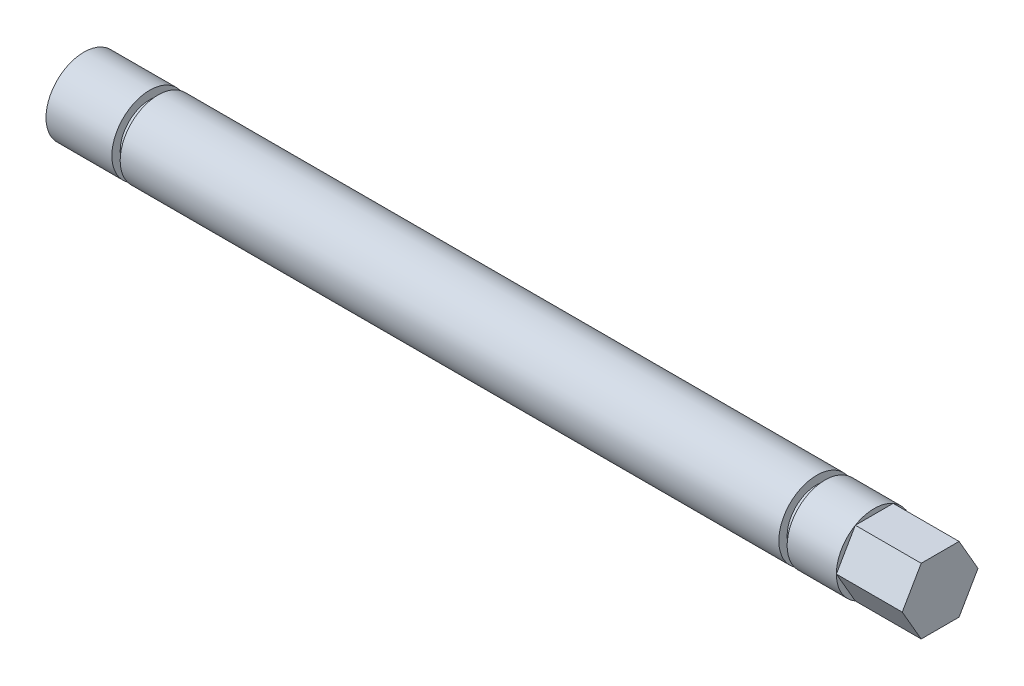
ISO-10303-21;
HEADER;
FILE_DESCRIPTION(('STEP AP214'),'2;1');
FILE_NAME('part.step','',(''),(''),'','','');
FILE_SCHEMA(('AUTOMOTIVE_DESIGN { 1 0 10303 214 1 1 1 1 }'));
ENDSEC;
DATA;
#1=APPLICATION_CONTEXT('core data for automotive mechanical design processes');
#2=APPLICATION_PROTOCOL_DEFINITION('international standard','automotive_design',2000,#1);
#3=PRODUCT_CONTEXT('',#1,'mechanical');
#4=PRODUCT('Part','Part','',(#3));
#5=PRODUCT_RELATED_PRODUCT_CATEGORY('part','',(#4));
#6=PRODUCT_DEFINITION_FORMATION('','',#4);
#7=PRODUCT_DEFINITION_CONTEXT('part definition',#1,'design');
#8=PRODUCT_DEFINITION('design','',#6,#7);
#9=PRODUCT_DEFINITION_SHAPE('','',#8);
#10=(LENGTH_UNIT() NAMED_UNIT(*) SI_UNIT(.MILLI.,.METRE.));
#11=(NAMED_UNIT(*) PLANE_ANGLE_UNIT() SI_UNIT($,.RADIAN.));
#12=(NAMED_UNIT(*) SI_UNIT($,.STERADIAN.) SOLID_ANGLE_UNIT());
#13=UNCERTAINTY_MEASURE_WITH_UNIT(LENGTH_MEASURE(1.E-05),#10,'distance_accuracy_value','');
#14=(GEOMETRIC_REPRESENTATION_CONTEXT(3) GLOBAL_UNCERTAINTY_ASSIGNED_CONTEXT((#13)) GLOBAL_UNIT_ASSIGNED_CONTEXT((#10,
#11,#12)) REPRESENTATION_CONTEXT('',''));
#15=CARTESIAN_POINT('',(0.,0.,0.));
#16=DIRECTION('',(0.,0.,1.));
#17=DIRECTION('',(1.,0.,0.));
#18=AXIS2_PLACEMENT_3D('',#15,#16,#17);
#19=CARTESIAN_POINT('',(165.1,0.,0.));
#20=DIRECTION('',(-1.,0.,0.));
#21=DIRECTION('',(0.,0.,1.));
#22=AXIS2_PLACEMENT_3D('',#19,#20,#21);
#23=CYLINDRICAL_SURFACE('',#22,7.3025);
#24=CARTESIAN_POINT('',(142.9004,0.,0.));
#25=DIRECTION('',(-1.,0.,0.));
#26=DIRECTION('',(0.,0.,1.));
#27=AXIS2_PLACEMENT_3D('',#24,#25,#26);
#28=CIRCLE('',#27,7.3025);
#29=CARTESIAN_POINT('',(142.9004,0.,7.3025));
#30=VERTEX_POINT('',#29);
#31=EDGE_CURVE('E148',#30,#30,#28,.T.);
#32=ORIENTED_EDGE('',*,*,#31,.F.);
#33=EDGE_LOOP('',(#32));
#34=FACE_BOUND('',#33,.T.);
#35=CARTESIAN_POINT('',(152.4,0.,0.));
#36=DIRECTION('',(1.,0.,0.));
#37=DIRECTION('',(0.,0.,-1.));
#38=AXIS2_PLACEMENT_3D('',#35,#36,#37);
#39=CIRCLE('',#38,7.3025);
#40=CARTESIAN_POINT('',(152.4,6.32415051113586,-3.65125));
#41=VERTEX_POINT('',#40);
#42=CARTESIAN_POINT('',(152.4,6.32415051113586,3.65125));
#43=VERTEX_POINT('',#42);
#44=EDGE_CURVE('E12',#41,#43,#39,.T.);
#45=ORIENTED_EDGE('',*,*,#44,.F.);
#46=CARTESIAN_POINT('',(152.4,0.,-7.3025));
#47=VERTEX_POINT('',#46);
#48=EDGE_CURVE('E44',#47,#41,#39,.T.);
#49=ORIENTED_EDGE('',*,*,#48,.F.);
#50=CARTESIAN_POINT('',(152.4,-6.32415051113586,-3.65125));
#51=VERTEX_POINT('',#50);
#52=EDGE_CURVE('E98',#51,#47,#39,.T.);
#53=ORIENTED_EDGE('',*,*,#52,.F.);
#54=CARTESIAN_POINT('',(152.4,-6.32415051113586,3.65125));
#55=VERTEX_POINT('',#54);
#56=EDGE_CURVE('E131',#55,#51,#39,.T.);
#57=ORIENTED_EDGE('',*,*,#56,.F.);
#58=CARTESIAN_POINT('',(152.4,0.,7.3025));
#59=VERTEX_POINT('',#58);
#60=EDGE_CURVE('E127',#59,#55,#39,.T.);
#61=ORIENTED_EDGE('',*,*,#60,.F.);
#62=EDGE_CURVE('E39',#43,#59,#39,.T.);
#63=ORIENTED_EDGE('',*,*,#62,.F.);
#64=EDGE_LOOP('',(#45,#49,#53,#57,#61,#63));
#65=FACE_BOUND('',#64,.T.);
#66=ADVANCED_FACE('F35',(#34,#65),#23,.T.);
#67=CARTESIAN_POINT('',(0.,0.,0.));
#68=DIRECTION('',(1.,0.,0.));
#69=DIRECTION('',(0.,0.,-1.));
#70=AXIS2_PLACEMENT_3D('',#67,#68,#69);
#71=CIRCLE('',#70,7.3025);
#72=CARTESIAN_POINT('',(0.,0.,-7.3025));
#73=VERTEX_POINT('',#72);
#74=EDGE_CURVE('E130',#73,#73,#71,.T.);
#75=ORIENTED_EDGE('',*,*,#74,.T.);
#76=EDGE_LOOP('',(#75));
#77=FACE_BOUND('',#76,.T.);
#78=CARTESIAN_POINT('',(12.7,0.,0.));
#79=DIRECTION('',(-1.,0.,0.));
#80=DIRECTION('',(0.,0.,1.));
#81=AXIS2_PLACEMENT_3D('',#78,#79,#80);
#82=CIRCLE('',#81,7.3025);
#83=CARTESIAN_POINT('',(12.7,0.,7.3025));
#84=VERTEX_POINT('',#83);
#85=EDGE_CURVE('E145',#84,#84,#82,.T.);
#86=ORIENTED_EDGE('',*,*,#85,.T.);
#87=EDGE_LOOP('',(#86));
#88=FACE_BOUND('',#87,.T.);
#89=ADVANCED_FACE('F37',(#77,#88),#23,.T.);
#90=CARTESIAN_POINT('',(0.,0.,0.));
#91=DIRECTION('',(1.,0.,0.));
#92=DIRECTION('',(0.,0.,-1.));
#93=AXIS2_PLACEMENT_3D('',#90,#91,#92);
#94=PLANE('',#93);
#95=ORIENTED_EDGE('',*,*,#74,.F.);
#96=EDGE_LOOP('',(#95));
#97=FACE_BOUND('',#96,.T.);
#98=ADVANCED_FACE('F206',(#97),#94,.F.);
#99=CARTESIAN_POINT('',(12.7,7.3025,0.));
#100=DIRECTION('',(1.,0.,0.));
#101=DIRECTION('',(0.,0.,-1.));
#102=AXIS2_PLACEMENT_3D('',#99,#100,#101);
#103=PLANE('',#102);
#104=CARTESIAN_POINT('',(12.7,0.,0.));
#105=DIRECTION('',(-1.,0.,0.));
#106=DIRECTION('',(0.,0.,1.));
#107=AXIS2_PLACEMENT_3D('',#104,#105,#106);
#108=CIRCLE('',#107,5.7023);
#109=CARTESIAN_POINT('',(12.7,0.,5.7023));
#110=VERTEX_POINT('',#109);
#111=EDGE_CURVE('E133',#110,#110,#108,.T.);
#112=ORIENTED_EDGE('',*,*,#111,.T.);
#113=EDGE_LOOP('',(#112));
#114=FACE_BOUND('',#113,.T.);
#115=ORIENTED_EDGE('',*,*,#85,.F.);
#116=EDGE_LOOP('',(#115));
#117=FACE_BOUND('',#116,.T.);
#118=ADVANCED_FACE('F230',(#114,#117),#103,.T.);
#119=CARTESIAN_POINT('',(0.,0.,0.));
#120=DIRECTION('',(-1.,0.,0.));
#121=DIRECTION('',(0.,0.,1.));
#122=AXIS2_PLACEMENT_3D('',#119,#120,#121);
#123=CYLINDRICAL_SURFACE('',#122,5.7023);
#124=CARTESIAN_POINT('',(14.3002,0.,0.));
#125=DIRECTION('',(-1.,0.,0.));
#126=DIRECTION('',(0.,0.,1.));
#127=AXIS2_PLACEMENT_3D('',#124,#125,#126);
#128=CIRCLE('',#127,5.7023);
#129=CARTESIAN_POINT('',(14.3002,0.,5.7023));
#130=VERTEX_POINT('',#129);
#131=EDGE_CURVE('E137',#130,#130,#128,.T.);
#132=ORIENTED_EDGE('',*,*,#131,.T.);
#133=EDGE_LOOP('',(#132));
#134=FACE_BOUND('',#133,.T.);
#135=ORIENTED_EDGE('',*,*,#111,.F.);
#136=EDGE_LOOP('',(#135));
#137=FACE_BOUND('',#136,.T.);
#138=ADVANCED_FACE('F219',(#134,#137),#123,.T.);
#139=CARTESIAN_POINT('',(14.3002,7.3025,0.));
#140=DIRECTION('',(-1.,0.,0.));
#141=DIRECTION('',(0.,0.,1.));
#142=AXIS2_PLACEMENT_3D('',#139,#140,#141);
#143=PLANE('',#142);
#144=CARTESIAN_POINT('',(14.3002,0.,0.));
#145=DIRECTION('',(-1.,0.,0.));
#146=DIRECTION('',(0.,0.,1.));
#147=AXIS2_PLACEMENT_3D('',#144,#145,#146);
#148=CIRCLE('',#147,7.3025);
#149=CARTESIAN_POINT('',(14.3002,0.,7.3025));
#150=VERTEX_POINT('',#149);
#151=EDGE_CURVE('E142',#150,#150,#148,.T.);
#152=ORIENTED_EDGE('',*,*,#151,.T.);
#153=EDGE_LOOP('',(#152));
#154=FACE_BOUND('',#153,.T.);
#155=ORIENTED_EDGE('',*,*,#131,.F.);
#156=EDGE_LOOP('',(#155));
#157=FACE_BOUND('',#156,.T.);
#158=ADVANCED_FACE('F210',(#154,#157),#143,.T.);
#159=CARTESIAN_POINT('',(141.3002,0.,0.));
#160=DIRECTION('',(-1.,0.,0.));
#161=DIRECTION('',(0.,0.,1.));
#162=AXIS2_PLACEMENT_3D('',#159,#160,#161);
#163=CIRCLE('',#162,7.3025);
#164=CARTESIAN_POINT('',(141.3002,0.,7.3025));
#165=VERTEX_POINT('',#164);
#166=EDGE_CURVE('E149',#165,#165,#163,.T.);
#167=ORIENTED_EDGE('',*,*,#166,.T.);
#168=EDGE_LOOP('',(#167));
#169=FACE_BOUND('',#168,.T.);
#170=ORIENTED_EDGE('',*,*,#151,.F.);
#171=EDGE_LOOP('',(#170));
#172=FACE_BOUND('',#171,.T.);
#173=ADVANCED_FACE('F202',(#169,#172),#23,.T.);
#174=CARTESIAN_POINT('',(142.9004,0.,0.));
#175=DIRECTION('',(-1.,0.,0.));
#176=DIRECTION('',(0.,0.,1.));
#177=AXIS2_PLACEMENT_3D('',#174,#175,#176);
#178=PLANE('',#177);
#179=CARTESIAN_POINT('',(142.9004,0.,0.));
#180=DIRECTION('',(-1.,0.,0.));
#181=DIRECTION('',(0.,0.,1.));
#182=AXIS2_PLACEMENT_3D('',#179,#180,#181);
#183=CIRCLE('',#182,5.7023);
#184=CARTESIAN_POINT('',(142.9004,0.,5.7023));
#185=VERTEX_POINT('',#184);
#186=EDGE_CURVE('E152',#185,#185,#183,.T.);
#187=ORIENTED_EDGE('',*,*,#186,.F.);
#188=EDGE_LOOP('',(#187));
#189=FACE_BOUND('',#188,.T.);
#190=ORIENTED_EDGE('',*,*,#31,.T.);
#191=EDGE_LOOP('',(#190));
#192=FACE_BOUND('',#191,.T.);
#193=ADVANCED_FACE('F209',(#189,#192),#178,.T.);
#194=CARTESIAN_POINT('',(141.3002,0.,0.));
#195=DIRECTION('',(-1.,0.,0.));
#196=DIRECTION('',(0.,0.,1.));
#197=AXIS2_PLACEMENT_3D('',#194,#195,#196);
#198=PLANE('',#197);
#199=CARTESIAN_POINT('',(141.3002,0.,0.));
#200=DIRECTION('',(-1.,0.,0.));
#201=DIRECTION('',(0.,0.,1.));
#202=AXIS2_PLACEMENT_3D('',#199,#200,#201);
#203=CIRCLE('',#202,5.7023);
#204=CARTESIAN_POINT('',(141.3002,0.,5.7023));
#205=VERTEX_POINT('',#204);
#206=EDGE_CURVE('E155',#205,#205,#203,.T.);
#207=ORIENTED_EDGE('',*,*,#206,.T.);
#208=EDGE_LOOP('',(#207));
#209=FACE_BOUND('',#208,.T.);
#210=ORIENTED_EDGE('',*,*,#166,.F.);
#211=EDGE_LOOP('',(#210));
#212=FACE_BOUND('',#211,.T.);
#213=ADVANCED_FACE('F216',(#209,#212),#198,.F.);
#214=CARTESIAN_POINT('',(142.9004,0.,0.));
#215=DIRECTION('',(-1.,0.,0.));
#216=DIRECTION('',(0.,0.,1.));
#217=AXIS2_PLACEMENT_3D('',#214,#215,#216);
#218=CYLINDRICAL_SURFACE('',#217,5.7023);
#219=ORIENTED_EDGE('',*,*,#186,.T.);
#220=EDGE_LOOP('',(#219));
#221=FACE_BOUND('',#220,.T.);
#222=ORIENTED_EDGE('',*,*,#206,.F.);
#223=EDGE_LOOP('',(#222));
#224=FACE_BOUND('',#223,.T.);
#225=ADVANCED_FACE('F282',(#221,#224),#218,.T.);
#226=CARTESIAN_POINT('',(152.4,0.,0.));
#227=DIRECTION('',(1.,0.,0.));
#228=DIRECTION('',(0.,0.,-1.));
#229=AXIS2_PLACEMENT_3D('',#226,#227,#228);
#230=PLANE('',#229);
#231=ORIENTED_EDGE('',*,*,#48,.T.);
#232=DIRECTION('',(0.,0.866025403784438,0.5));
#233=VECTOR('',#232,1.);
#234=CARTESIAN_POINT('',(152.4,0.,-7.3025));
#235=LINE('',#234,#233);
#236=EDGE_CURVE('E93',#47,#41,#235,.T.);
#237=ORIENTED_EDGE('',*,*,#236,.F.);
#238=EDGE_LOOP('',(#231,#237));
#239=FACE_BOUND('',#238,.T.);
#240=ADVANCED_FACE('F91',(#239),#230,.T.);
#241=ORIENTED_EDGE('',*,*,#44,.T.);
#242=DIRECTION('',(0.,0.,1.));
#243=VECTOR('',#242,1.);
#244=CARTESIAN_POINT('',(152.4,6.32415051113586,-3.65125));
#245=LINE('',#244,#243);
#246=EDGE_CURVE('E105',#41,#43,#245,.T.);
#247=ORIENTED_EDGE('',*,*,#246,.F.);
#248=EDGE_LOOP('',(#241,#247));
#249=FACE_BOUND('',#248,.T.);
#250=ADVANCED_FACE('F116',(#249),#230,.T.);
#251=ORIENTED_EDGE('',*,*,#62,.T.);
#252=DIRECTION('',(0.,-0.866025403784439,0.5));
#253=VECTOR('',#252,1.);
#254=CARTESIAN_POINT('',(152.4,6.32415051113586,3.65125));
#255=LINE('',#254,#253);
#256=EDGE_CURVE('E118',#43,#59,#255,.T.);
#257=ORIENTED_EDGE('',*,*,#256,.F.);
#258=EDGE_LOOP('',(#251,#257));
#259=FACE_BOUND('',#258,.T.);
#260=ADVANCED_FACE('F188',(#259),#230,.T.);
#261=ORIENTED_EDGE('',*,*,#60,.T.);
#262=DIRECTION('',(0.,-0.866025403784439,-0.5));
#263=VECTOR('',#262,1.);
#264=CARTESIAN_POINT('',(152.4,0.,7.3025));
#265=LINE('',#264,#263);
#266=EDGE_CURVE('E182',#59,#55,#265,.T.);
#267=ORIENTED_EDGE('',*,*,#266,.F.);
#268=EDGE_LOOP('',(#261,#267));
#269=FACE_BOUND('',#268,.T.);
#270=ADVANCED_FACE('F190',(#269),#230,.T.);
#271=ORIENTED_EDGE('',*,*,#56,.T.);
#272=DIRECTION('',(0.,0.,-1.));
#273=VECTOR('',#272,1.);
#274=CARTESIAN_POINT('',(152.4,-6.32415051113586,3.65125));
#275=LINE('',#274,#273);
#276=EDGE_CURVE('E51',#55,#51,#275,.T.);
#277=ORIENTED_EDGE('',*,*,#276,.F.);
#278=EDGE_LOOP('',(#271,#277));
#279=FACE_BOUND('',#278,.T.);
#280=ADVANCED_FACE('F196',(#279),#230,.T.);
#281=ORIENTED_EDGE('',*,*,#52,.T.);
#282=DIRECTION('',(0.,0.866025403784439,-0.5));
#283=VECTOR('',#282,1.);
#284=CARTESIAN_POINT('',(152.4,-6.32415051113586,-3.65125));
#285=LINE('',#284,#283);
#286=EDGE_CURVE('E113',#51,#47,#285,.T.);
#287=ORIENTED_EDGE('',*,*,#286,.F.);
#288=EDGE_LOOP('',(#281,#287));
#289=FACE_BOUND('',#288,.T.);
#290=ADVANCED_FACE('F258',(#289),#230,.T.);
#291=CARTESIAN_POINT('',(152.4,0.,-7.3025));
#292=DIRECTION('',(0.,0.5,-0.866025403784438));
#293=DIRECTION('',(0.,0.866025403784439,0.5));
#294=AXIS2_PLACEMENT_3D('',#291,#292,#293);
#295=PLANE('',#294);
#296=DIRECTION('',(0.,0.866025403784438,0.5));
#297=VECTOR('',#296,1.);
#298=CARTESIAN_POINT('',(165.1,0.,-7.3025));
#299=LINE('',#298,#297);
#300=CARTESIAN_POINT('',(165.1,0.,-7.3025));
#301=VERTEX_POINT('',#300);
#302=CARTESIAN_POINT('',(165.1,6.32415051113586,-3.65125));
#303=VERTEX_POINT('',#302);
#304=EDGE_CURVE('E178',#301,#303,#299,.T.);
#305=ORIENTED_EDGE('',*,*,#304,.F.);
#306=DIRECTION('',(1.,0.,0.));
#307=VECTOR('',#306,1.);
#308=CARTESIAN_POINT('',(152.4,0.,-7.3025));
#309=LINE('',#308,#307);
#310=EDGE_CURVE('E122',#47,#301,#309,.T.);
#311=ORIENTED_EDGE('',*,*,#310,.F.);
#312=ORIENTED_EDGE('',*,*,#236,.T.);
#313=DIRECTION('',(1.,0.,0.));
#314=VECTOR('',#313,1.);
#315=CARTESIAN_POINT('',(152.4,6.32415051113586,-3.65125));
#316=LINE('',#315,#314);
#317=EDGE_CURVE('E102',#41,#303,#316,.T.);
#318=ORIENTED_EDGE('',*,*,#317,.T.);
#319=EDGE_LOOP('',(#305,#311,#312,#318));
#320=FACE_BOUND('',#319,.T.);
#321=ADVANCED_FACE('F121',(#320),#295,.T.);
#322=CARTESIAN_POINT('',(152.4,-6.32415051113586,-3.65125));
#323=DIRECTION('',(0.,-0.5,-0.866025403784438));
#324=DIRECTION('',(0.,0.866025403784439,-0.5));
#325=AXIS2_PLACEMENT_3D('',#322,#323,#324);
#326=PLANE('',#325);
#327=DIRECTION('',(0.,0.866025403784439,-0.5));
#328=VECTOR('',#327,1.);
#329=CARTESIAN_POINT('',(165.1,-6.32415051113586,-3.65125));
#330=LINE('',#329,#328);
#331=CARTESIAN_POINT('',(165.1,-6.32415051113586,-3.65125));
#332=VERTEX_POINT('',#331);
#333=EDGE_CURVE('E123',#332,#301,#330,.T.);
#334=ORIENTED_EDGE('',*,*,#333,.F.);
#335=DIRECTION('',(1.,0.,0.));
#336=VECTOR('',#335,1.);
#337=CARTESIAN_POINT('',(152.4,-6.32415051113586,-3.65125));
#338=LINE('',#337,#336);
#339=EDGE_CURVE('E165',#51,#332,#338,.T.);
#340=ORIENTED_EDGE('',*,*,#339,.F.);
#341=ORIENTED_EDGE('',*,*,#286,.T.);
#342=ORIENTED_EDGE('',*,*,#310,.T.);
#343=EDGE_LOOP('',(#334,#340,#341,#342));
#344=FACE_BOUND('',#343,.T.);
#345=ADVANCED_FACE('F255',(#344),#326,.T.);
#346=CARTESIAN_POINT('',(152.4,-6.32415051113586,3.65125));
#347=DIRECTION('',(0.,-1.,0.));
#348=DIRECTION('',(0.,0.,-1.));
#349=AXIS2_PLACEMENT_3D('',#346,#347,#348);
#350=PLANE('',#349);
#351=DIRECTION('',(0.,0.,-1.));
#352=VECTOR('',#351,1.);
#353=CARTESIAN_POINT('',(165.1,-6.32415051113586,3.65125));
#354=LINE('',#353,#352);
#355=CARTESIAN_POINT('',(165.1,-6.32415051113586,3.65125));
#356=VERTEX_POINT('',#355);
#357=EDGE_CURVE('E170',#356,#332,#354,.T.);
#358=ORIENTED_EDGE('',*,*,#357,.F.);
#359=DIRECTION('',(1.,0.,0.));
#360=VECTOR('',#359,1.);
#361=CARTESIAN_POINT('',(152.4,-6.32415051113586,3.65125));
#362=LINE('',#361,#360);
#363=EDGE_CURVE('E163',#55,#356,#362,.T.);
#364=ORIENTED_EDGE('',*,*,#363,.F.);
#365=ORIENTED_EDGE('',*,*,#276,.T.);
#366=ORIENTED_EDGE('',*,*,#339,.T.);
#367=EDGE_LOOP('',(#358,#364,#365,#366));
#368=FACE_BOUND('',#367,.T.);
#369=ADVANCED_FACE('F263',(#368),#350,.T.);
#370=CARTESIAN_POINT('',(152.4,0.,7.3025));
#371=DIRECTION('',(0.,-0.5,0.866025403784439));
#372=DIRECTION('',(0.,-0.866025403784439,-0.5));
#373=AXIS2_PLACEMENT_3D('',#370,#371,#372);
#374=PLANE('',#373);
#375=DIRECTION('',(0.,-0.866025403784439,-0.5));
#376=VECTOR('',#375,1.);
#377=CARTESIAN_POINT('',(165.1,0.,7.3025));
#378=LINE('',#377,#376);
#379=CARTESIAN_POINT('',(165.1,0.,7.3025));
#380=VERTEX_POINT('',#379);
#381=EDGE_CURVE('E173',#380,#356,#378,.T.);
#382=ORIENTED_EDGE('',*,*,#381,.F.);
#383=DIRECTION('',(1.,0.,0.));
#384=VECTOR('',#383,1.);
#385=CARTESIAN_POINT('',(152.4,0.,7.3025));
#386=LINE('',#385,#384);
#387=EDGE_CURVE('E161',#59,#380,#386,.T.);
#388=ORIENTED_EDGE('',*,*,#387,.F.);
#389=ORIENTED_EDGE('',*,*,#266,.T.);
#390=ORIENTED_EDGE('',*,*,#363,.T.);
#391=EDGE_LOOP('',(#382,#388,#389,#390));
#392=FACE_BOUND('',#391,.T.);
#393=ADVANCED_FACE('F262',(#392),#374,.T.);
#394=CARTESIAN_POINT('',(152.4,6.32415051113586,3.65125));
#395=DIRECTION('',(0.,0.5,0.866025403784439));
#396=DIRECTION('',(0.,-0.866025403784439,0.5));
#397=AXIS2_PLACEMENT_3D('',#394,#395,#396);
#398=PLANE('',#397);
#399=DIRECTION('',(0.,-0.866025403784439,0.5));
#400=VECTOR('',#399,1.);
#401=CARTESIAN_POINT('',(165.1,6.32415051113586,3.65125));
#402=LINE('',#401,#400);
#403=CARTESIAN_POINT('',(165.1,6.32415051113586,3.65125));
#404=VERTEX_POINT('',#403);
#405=EDGE_CURVE('E59',#404,#380,#402,.T.);
#406=ORIENTED_EDGE('',*,*,#405,.F.);
#407=DIRECTION('',(1.,0.,0.));
#408=VECTOR('',#407,1.);
#409=CARTESIAN_POINT('',(152.4,6.32415051113586,3.65125));
#410=LINE('',#409,#408);
#411=EDGE_CURVE('E112',#43,#404,#410,.T.);
#412=ORIENTED_EDGE('',*,*,#411,.F.);
#413=ORIENTED_EDGE('',*,*,#256,.T.);
#414=ORIENTED_EDGE('',*,*,#387,.T.);
#415=EDGE_LOOP('',(#406,#412,#413,#414));
#416=FACE_BOUND('',#415,.T.);
#417=ADVANCED_FACE('F186',(#416),#398,.T.);
#418=CARTESIAN_POINT('',(152.4,6.32415051113586,-3.65125));
#419=DIRECTION('',(0.,1.,0.));
#420=DIRECTION('',(0.,0.,1.));
#421=AXIS2_PLACEMENT_3D('',#418,#419,#420);
#422=PLANE('',#421);
#423=DIRECTION('',(0.,0.,1.));
#424=VECTOR('',#423,1.);
#425=CARTESIAN_POINT('',(165.1,6.32415051113586,-3.65125));
#426=LINE('',#425,#424);
#427=EDGE_CURVE('E108',#303,#404,#426,.T.);
#428=ORIENTED_EDGE('',*,*,#427,.F.);
#429=ORIENTED_EDGE('',*,*,#317,.F.);
#430=ORIENTED_EDGE('',*,*,#246,.T.);
#431=ORIENTED_EDGE('',*,*,#411,.T.);
#432=EDGE_LOOP('',(#428,#429,#430,#431));
#433=FACE_BOUND('',#432,.T.);
#434=ADVANCED_FACE('F104',(#433),#422,.T.);
#435=CARTESIAN_POINT('',(165.1,0.,0.));
#436=DIRECTION('',(1.,0.,0.));
#437=DIRECTION('',(0.,0.,-1.));
#438=AXIS2_PLACEMENT_3D('',#435,#436,#437);
#439=PLANE('',#438);
#440=ORIENTED_EDGE('',*,*,#333,.T.);
#441=ORIENTED_EDGE('',*,*,#304,.T.);
#442=ORIENTED_EDGE('',*,*,#427,.T.);
#443=ORIENTED_EDGE('',*,*,#405,.T.);
#444=ORIENTED_EDGE('',*,*,#381,.T.);
#445=ORIENTED_EDGE('',*,*,#357,.T.);
#446=EDGE_LOOP('',(#440,#441,#442,#443,#444,#445));
#447=FACE_BOUND('',#446,.T.);
#448=ADVANCED_FACE('F244',(#447),#439,.T.);
#449=CLOSED_SHELL('',(#66,#89,#98,#118,#138,#158,#173,#193,#213,#225,#240,#250,#260,#270,#280,
#290,#321,#345,#369,#393,#417,#434,#448));
#450=MANIFOLD_SOLID_BREP('B2',#449);
#451=ADVANCED_BREP_SHAPE_REPRESENTATION('',(#18,#450),#14);
#452=SHAPE_DEFINITION_REPRESENTATION(#9,#451);
ENDSEC;
END-ISO-10303-21;
